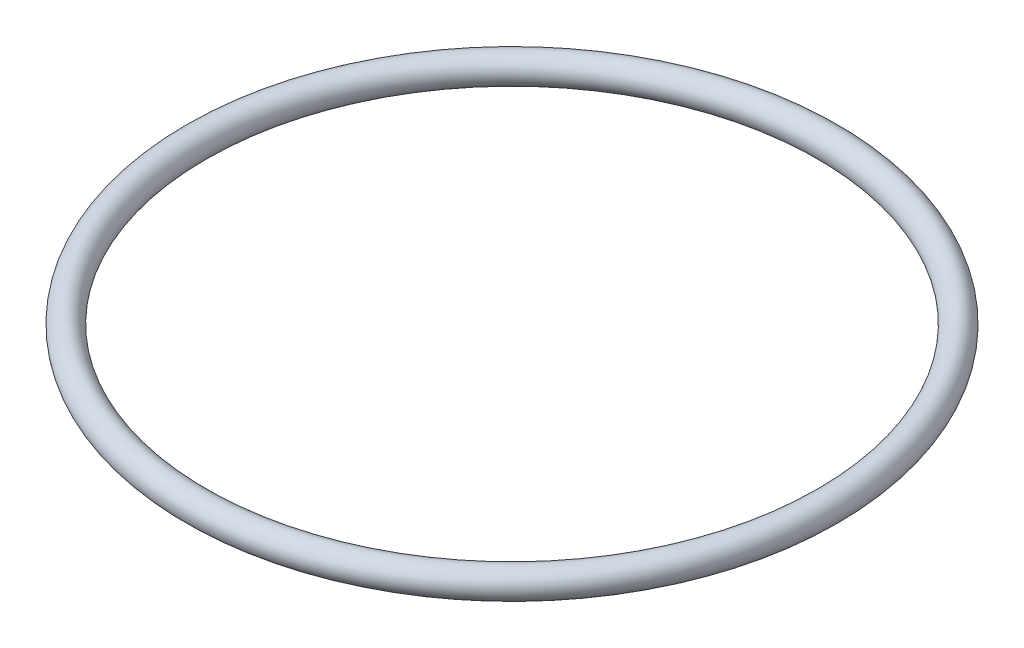
ISO-10303-21;
HEADER;
FILE_DESCRIPTION(('STEP AP214'),'2;1');
FILE_NAME('part.step','',(''),(''),'','','');
FILE_SCHEMA(('AUTOMOTIVE_DESIGN { 1 0 10303 214 1 1 1 1 }'));
ENDSEC;
DATA;
#1=APPLICATION_CONTEXT('core data for automotive mechanical design processes');
#2=APPLICATION_PROTOCOL_DEFINITION('international standard','automotive_design',2000,#1);
#3=PRODUCT_CONTEXT('',#1,'mechanical');
#4=PRODUCT('Part','Part','',(#3));
#5=PRODUCT_RELATED_PRODUCT_CATEGORY('part','',(#4));
#6=PRODUCT_DEFINITION_FORMATION('','',#4);
#7=PRODUCT_DEFINITION_CONTEXT('part definition',#1,'design');
#8=PRODUCT_DEFINITION('design','',#6,#7);
#9=PRODUCT_DEFINITION_SHAPE('','',#8);
#10=(LENGTH_UNIT() NAMED_UNIT(*) SI_UNIT(.MILLI.,.METRE.));
#11=(NAMED_UNIT(*) PLANE_ANGLE_UNIT() SI_UNIT($,.RADIAN.));
#12=(NAMED_UNIT(*) SI_UNIT($,.STERADIAN.) SOLID_ANGLE_UNIT());
#13=UNCERTAINTY_MEASURE_WITH_UNIT(LENGTH_MEASURE(1.E-05),#10,'distance_accuracy_value','');
#14=(GEOMETRIC_REPRESENTATION_CONTEXT(3) GLOBAL_UNCERTAINTY_ASSIGNED_CONTEXT((#13)) GLOBAL_UNIT_ASSIGNED_CONTEXT((#10,
#11,#12)) REPRESENTATION_CONTEXT('',''));
#15=CARTESIAN_POINT('',(0.,0.,0.));
#16=DIRECTION('',(0.,0.,1.));
#17=DIRECTION('',(1.,0.,0.));
#18=AXIS2_PLACEMENT_3D('',#15,#16,#17);
#19=CARTESIAN_POINT('',(0.,0.,0.));
#20=DIRECTION('',(0.,1.,0.));
#21=DIRECTION('',(0.,0.,1.));
#22=AXIS2_PLACEMENT_3D('',#19,#20,#21);
#23=TOROIDAL_SURFACE('',#22,67.447846,3.00000000000001);
#24=CARTESIAN_POINT('',(-67.447846,0.,0.));
#25=DIRECTION('',(0.,0.,1.));
#26=DIRECTION('',(1.,0.,0.));
#27=AXIS2_PLACEMENT_3D('',#24,#25,#26);
#28=CIRCLE('',#27,3.00000000000001);
#29=CARTESIAN_POINT('',(-70.447846,0.,0.));
#30=VERTEX_POINT('',#29);
#31=EDGE_CURVE('E10',#30,#30,#28,.T.);
#32=CARTESIAN_POINT('',(0.,0.,0.));
#33=DIRECTION('',(0.,1.,0.));
#34=DIRECTION('',(0.,0.,1.));
#35=AXIS2_PLACEMENT_3D('',#32,#33,#34);
#36=CIRCLE('',#35,70.447846);
#37=EDGE_CURVE('',#30,#30,#36,.T.);
#38=ORIENTED_EDGE('',*,*,#31,.T.);
#39=ORIENTED_EDGE('',*,*,#31,.F.);
#40=ORIENTED_EDGE('',*,*,#37,.T.);
#41=ORIENTED_EDGE('',*,*,#37,.F.);
#42=EDGE_LOOP('',(#38,#40,#39,#41));
#43=FACE_BOUND('',#42,.T.);
#44=ADVANCED_FACE('F37',(#43),#23,.T.);
#45=CLOSED_SHELL('',(#44));
#46=MANIFOLD_SOLID_BREP('B2',#45);
#47=ADVANCED_BREP_SHAPE_REPRESENTATION('',(#18,#46),#14);
#48=SHAPE_DEFINITION_REPRESENTATION(#9,#47);
ENDSEC;
END-ISO-10303-21;
